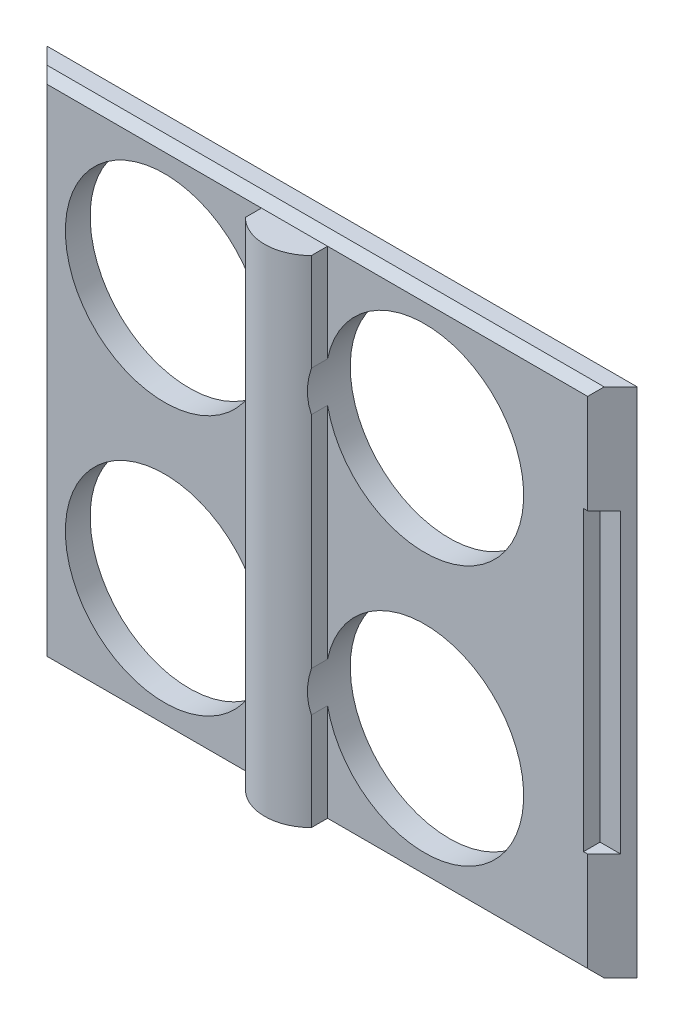
ISO-10303-21;
HEADER;
FILE_DESCRIPTION(('STEP AP214'),'2;1');
FILE_NAME('part.step','',(''),(''),'','','');
FILE_SCHEMA(('AUTOMOTIVE_DESIGN { 1 0 10303 214 1 1 1 1 }'));
ENDSEC;
DATA;
#1=APPLICATION_CONTEXT('core data for automotive mechanical design processes');
#2=APPLICATION_PROTOCOL_DEFINITION('international standard','automotive_design',2000,#1);
#3=PRODUCT_CONTEXT('',#1,'mechanical');
#4=PRODUCT('Part','Part','',(#3));
#5=PRODUCT_RELATED_PRODUCT_CATEGORY('part','',(#4));
#6=PRODUCT_DEFINITION_FORMATION('','',#4);
#7=PRODUCT_DEFINITION_CONTEXT('part definition',#1,'design');
#8=PRODUCT_DEFINITION('design','',#6,#7);
#9=PRODUCT_DEFINITION_SHAPE('','',#8);
#10=(LENGTH_UNIT() NAMED_UNIT(*) SI_UNIT(.MILLI.,.METRE.));
#11=(NAMED_UNIT(*) PLANE_ANGLE_UNIT() SI_UNIT($,.RADIAN.));
#12=(NAMED_UNIT(*) SI_UNIT($,.STERADIAN.) SOLID_ANGLE_UNIT());
#13=UNCERTAINTY_MEASURE_WITH_UNIT(LENGTH_MEASURE(1.E-05),#10,'distance_accuracy_value','');
#14=(GEOMETRIC_REPRESENTATION_CONTEXT(3) GLOBAL_UNCERTAINTY_ASSIGNED_CONTEXT((#13)) GLOBAL_UNIT_ASSIGNED_CONTEXT((#10,
#11,#12)) REPRESENTATION_CONTEXT('',''));
#15=CARTESIAN_POINT('',(0.,0.,0.));
#16=DIRECTION('',(0.,0.,1.));
#17=DIRECTION('',(1.,0.,0.));
#18=AXIS2_PLACEMENT_3D('',#15,#16,#17);
#19=CARTESIAN_POINT('',(0.,60.,3.));
#20=DIRECTION('',(0.,0.707106781186547,0.707106781186548));
#21=DIRECTION('',(0.,-0.707106781186548,0.707106781186547));
#22=AXIS2_PLACEMENT_3D('',#19,#20,#21);
#23=PLANE('',#22);
#24=DIRECTION('',(1.,0.,0.));
#25=VECTOR('',#24,1.);
#26=CARTESIAN_POINT('',(0.,61.,2.));
#27=LINE('',#26,#25);
#28=CARTESIAN_POINT('',(-1.,61.,2.));
#29=VERTEX_POINT('',#28);
#30=CARTESIAN_POINT('',(66.5,61.,2.00000000000001));
#31=VERTEX_POINT('',#30);
#32=EDGE_CURVE('E65',#29,#31,#27,.T.);
#33=ORIENTED_EDGE('',*,*,#32,.F.);
#34=DIRECTION('',(0.577350269189626,-0.577350269189626,0.577350269189626));
#35=VECTOR('',#34,1.);
#36=CARTESIAN_POINT('',(0.,60.,3.));
#37=LINE('',#36,#35);
#38=CARTESIAN_POINT('',(0.,60.,3.));
#39=VERTEX_POINT('',#38);
#40=EDGE_CURVE('E339',#29,#39,#37,.T.);
#41=ORIENTED_EDGE('',*,*,#40,.T.);
#42=DIRECTION('',(-1.,0.,0.));
#43=VECTOR('',#42,1.);
#44=CARTESIAN_POINT('',(0.,60.,3.));
#45=LINE('',#44,#43);
#46=CARTESIAN_POINT('',(26.,60.,3.));
#47=VERTEX_POINT('',#46);
#48=EDGE_CURVE('E244',#47,#39,#45,.T.);
#49=ORIENTED_EDGE('',*,*,#48,.F.);
#50=DIRECTION('',(1.,0.,0.));
#51=VECTOR('',#50,1.);
#52=CARTESIAN_POINT('',(0.,60.,3.));
#53=LINE('',#52,#51);
#54=CARTESIAN_POINT('',(34.,60.,3.));
#55=VERTEX_POINT('',#54);
#56=EDGE_CURVE('E252',#47,#55,#53,.T.);
#57=ORIENTED_EDGE('',*,*,#56,.T.);
#58=CARTESIAN_POINT('',(65.5000000000001,60.,3.));
#59=VERTEX_POINT('',#58);
#60=EDGE_CURVE('E245',#59,#55,#45,.T.);
#61=ORIENTED_EDGE('',*,*,#60,.F.);
#62=DIRECTION('',(0.577350269189619,0.57735026918963,-0.577350269189629));
#63=VECTOR('',#62,1.);
#64=CARTESIAN_POINT('',(43.6666666666672,38.1666666666668,24.8333333333332));
#65=LINE('',#64,#63);
#66=EDGE_CURVE('E380',#59,#31,#65,.T.);
#67=ORIENTED_EDGE('',*,*,#66,.T.);
#68=EDGE_LOOP('',(#33,#41,#49,#57,#61,#67));
#69=FACE_BOUND('',#68,.T.);
#70=ADVANCED_FACE('F43',(#69),#23,.T.);
#71=CARTESIAN_POINT('',(0.,-3.,0.));
#72=DIRECTION('',(0.,-0.707106781186548,0.707106781186547));
#73=DIRECTION('',(0.,-0.707106781186547,-0.707106781186548));
#74=AXIS2_PLACEMENT_3D('',#71,#72,#73);
#75=PLANE('',#74);
#76=DIRECTION('',(-1.,0.,0.));
#77=VECTOR('',#76,1.);
#78=CARTESIAN_POINT('',(0.,-1.00000000000001,1.99999999999999));
#79=LINE('',#78,#77);
#80=CARTESIAN_POINT('',(66.5,-0.999999999999994,2.00000000000002));
#81=VERTEX_POINT('',#80);
#82=CARTESIAN_POINT('',(-1.00000000000001,-1.00000000000001,1.99999999999999));
#83=VERTEX_POINT('',#82);
#84=EDGE_CURVE('E360',#81,#83,#79,.T.);
#85=ORIENTED_EDGE('',*,*,#84,.F.);
#86=DIRECTION('',(-0.577350269189619,0.577350269189629,0.577350269189629));
#87=VECTOR('',#86,1.);
#88=CARTESIAN_POINT('',(45.6666666666672,19.8333333333332,22.8333333333332));
#89=LINE('',#88,#87);
#90=CARTESIAN_POINT('',(65.5000000000001,0.,3.));
#91=VERTEX_POINT('',#90);
#92=EDGE_CURVE('E378',#81,#91,#89,.T.);
#93=ORIENTED_EDGE('',*,*,#92,.T.);
#94=DIRECTION('',(1.,0.,0.));
#95=VECTOR('',#94,1.);
#96=CARTESIAN_POINT('',(0.,0.,3.));
#97=LINE('',#96,#95);
#98=CARTESIAN_POINT('',(34.,0.,3.));
#99=VERTEX_POINT('',#98);
#100=EDGE_CURVE('E239',#99,#91,#97,.T.);
#101=ORIENTED_EDGE('',*,*,#100,.F.);
#102=DIRECTION('',(1.,0.,0.));
#103=VECTOR('',#102,1.);
#104=CARTESIAN_POINT('',(0.,0.,3.));
#105=LINE('',#104,#103);
#106=CARTESIAN_POINT('',(26.,0.,3.));
#107=VERTEX_POINT('',#106);
#108=EDGE_CURVE('E248',#107,#99,#105,.T.);
#109=ORIENTED_EDGE('',*,*,#108,.F.);
#110=CARTESIAN_POINT('',(0.,0.,3.));
#111=VERTEX_POINT('',#110);
#112=EDGE_CURVE('E242',#111,#107,#97,.T.);
#113=ORIENTED_EDGE('',*,*,#112,.F.);
#114=DIRECTION('',(-0.577350269189626,-0.577350269189626,-0.577350269189626));
#115=VECTOR('',#114,1.);
#116=CARTESIAN_POINT('',(-2.,-2.,1.));
#117=LINE('',#116,#115);
#118=EDGE_CURVE('E336',#111,#83,#117,.T.);
#119=ORIENTED_EDGE('',*,*,#118,.T.);
#120=EDGE_LOOP('',(#85,#93,#101,#109,#113,#119));
#121=FACE_BOUND('',#120,.T.);
#122=ADVANCED_FACE('F428',(#121),#75,.T.);
#123=CARTESIAN_POINT('',(0.,0.,3.));
#124=DIRECTION('',(0.,0.,-1.));
#125=DIRECTION('',(-1.,0.,0.));
#126=AXIS2_PLACEMENT_3D('',#123,#124,#125);
#127=PLANE('',#126);
#128=DIRECTION('',(0.,-1.,0.));
#129=VECTOR('',#128,1.);
#130=CARTESIAN_POINT('',(65.5000000000001,63.,3.));
#131=LINE('',#130,#129);
#132=CARTESIAN_POINT('',(65.5000000000001,48.,3.));
#133=VERTEX_POINT('',#132);
#134=EDGE_CURVE('E288',#59,#133,#131,.T.);
#135=ORIENTED_EDGE('',*,*,#134,.F.);
#136=ORIENTED_EDGE('',*,*,#60,.T.);
#137=DIRECTION('',(0.,1.,0.));
#138=VECTOR('',#137,1.);
#139=CARTESIAN_POINT('',(34.,60.,3.));
#140=LINE('',#139,#138);
#141=CARTESIAN_POINT('',(34.,48.1866985862022,3.));
#142=VERTEX_POINT('',#141);
#143=EDGE_CURVE('E247',#142,#55,#140,.T.);
#144=ORIENTED_EDGE('',*,*,#143,.F.);
#145=CARTESIAN_POINT('',(45.75,45.75,3.));
#146=DIRECTION('',(0.,0.,1.));
#147=DIRECTION('',(1.,0.,0.));
#148=AXIS2_PLACEMENT_3D('',#145,#146,#147);
#149=CIRCLE('',#148,12.);
#150=CARTESIAN_POINT('',(34.,43.3133014137978,3.));
#151=VERTEX_POINT('',#150);
#152=EDGE_CURVE('E230',#151,#142,#149,.T.);
#153=ORIENTED_EDGE('',*,*,#152,.F.);
#154=CARTESIAN_POINT('',(34.,16.6866985862023,3.));
#155=VERTEX_POINT('',#154);
#156=EDGE_CURVE('E269',#155,#151,#140,.T.);
#157=ORIENTED_EDGE('',*,*,#156,.F.);
#158=CARTESIAN_POINT('',(45.75,14.25,3.));
#159=DIRECTION('',(0.,0.,1.));
#160=DIRECTION('',(1.,0.,0.));
#161=AXIS2_PLACEMENT_3D('',#158,#159,#160);
#162=CIRCLE('',#161,12.);
#163=CARTESIAN_POINT('',(34.,11.8133014137977,3.));
#164=VERTEX_POINT('',#163);
#165=EDGE_CURVE('E224',#164,#155,#162,.T.);
#166=ORIENTED_EDGE('',*,*,#165,.F.);
#167=EDGE_CURVE('E264',#99,#164,#140,.T.);
#168=ORIENTED_EDGE('',*,*,#167,.F.);
#169=ORIENTED_EDGE('',*,*,#100,.T.);
#170=CARTESIAN_POINT('',(65.5000000000001,12.,3.));
#171=VERTEX_POINT('',#170);
#172=EDGE_CURVE('E368',#171,#91,#131,.T.);
#173=ORIENTED_EDGE('',*,*,#172,.F.);
#174=DIRECTION('',(1.,0.,0.));
#175=VECTOR('',#174,1.);
#176=CARTESIAN_POINT('',(65.,12.,3.));
#177=LINE('',#176,#175);
#178=CARTESIAN_POINT('',(65.,12.,3.));
#179=VERTEX_POINT('',#178);
#180=EDGE_CURVE('E396',#179,#171,#177,.T.);
#181=ORIENTED_EDGE('',*,*,#180,.F.);
#182=DIRECTION('',(0.,-1.,0.));
#183=VECTOR('',#182,1.);
#184=CARTESIAN_POINT('',(65.,48.,3.));
#185=LINE('',#184,#183);
#186=CARTESIAN_POINT('',(65.,48.,3.));
#187=VERTEX_POINT('',#186);
#188=EDGE_CURVE('E383',#187,#179,#185,.T.);
#189=ORIENTED_EDGE('',*,*,#188,.F.);
#190=DIRECTION('',(-1.,0.,0.));
#191=VECTOR('',#190,1.);
#192=CARTESIAN_POINT('',(65.,48.,3.));
#193=LINE('',#192,#191);
#194=EDGE_CURVE('E388',#133,#187,#193,.T.);
#195=ORIENTED_EDGE('',*,*,#194,.F.);
#196=EDGE_LOOP('',(#135,#136,#144,#153,#157,#166,#168,#169,#173,#181,#189,#195));
#197=FACE_BOUND('',#196,.T.);
#198=ADVANCED_FACE('F285',(#197),#127,.F.);
#199=CARTESIAN_POINT('',(65.,48.,1.));
#200=DIRECTION('',(0.,1.,0.));
#201=DIRECTION('',(0.,0.,1.));
#202=AXIS2_PLACEMENT_3D('',#199,#200,#201);
#203=PLANE('',#202);
#204=DIRECTION('',(0.707106781186541,0.,-0.707106781186554));
#205=VECTOR('',#204,1.);
#206=CARTESIAN_POINT('',(66.25,48.,2.25000000000001));
#207=LINE('',#206,#205);
#208=CARTESIAN_POINT('',(67.5,48.,1.));
#209=VERTEX_POINT('',#208);
#210=EDGE_CURVE('E376',#133,#209,#207,.T.);
#211=ORIENTED_EDGE('',*,*,#210,.F.);
#212=ORIENTED_EDGE('',*,*,#194,.T.);
#213=DIRECTION('',(0.,0.,1.));
#214=VECTOR('',#213,1.);
#215=CARTESIAN_POINT('',(65.,48.,1.));
#216=LINE('',#215,#214);
#217=CARTESIAN_POINT('',(65.,48.,1.));
#218=VERTEX_POINT('',#217);
#219=EDGE_CURVE('E400',#218,#187,#216,.T.);
#220=ORIENTED_EDGE('',*,*,#219,.F.);
#221=DIRECTION('',(-1.,0.,0.));
#222=VECTOR('',#221,1.);
#223=CARTESIAN_POINT('',(65.,48.,1.));
#224=LINE('',#223,#222);
#225=EDGE_CURVE('E391',#209,#218,#224,.T.);
#226=ORIENTED_EDGE('',*,*,#225,.F.);
#227=EDGE_LOOP('',(#211,#212,#220,#226));
#228=FACE_BOUND('',#227,.T.);
#229=ADVANCED_FACE('F447',(#228),#203,.F.);
#230=CARTESIAN_POINT('',(65.,12.,1.));
#231=DIRECTION('',(0.,-1.,0.));
#232=DIRECTION('',(0.,0.,-1.));
#233=AXIS2_PLACEMENT_3D('',#230,#231,#232);
#234=PLANE('',#233);
#235=DIRECTION('',(-0.707106781186541,0.,0.707106781186554));
#236=VECTOR('',#235,1.);
#237=CARTESIAN_POINT('',(66.25,12.,2.25000000000002));
#238=LINE('',#237,#236);
#239=CARTESIAN_POINT('',(67.5,12.,1.));
#240=VERTEX_POINT('',#239);
#241=EDGE_CURVE('E374',#240,#171,#238,.T.);
#242=ORIENTED_EDGE('',*,*,#241,.F.);
#243=DIRECTION('',(1.,0.,0.));
#244=VECTOR('',#243,1.);
#245=CARTESIAN_POINT('',(65.,12.,1.));
#246=LINE('',#245,#244);
#247=CARTESIAN_POINT('',(65.,12.,1.));
#248=VERTEX_POINT('',#247);
#249=EDGE_CURVE('E387',#248,#240,#246,.T.);
#250=ORIENTED_EDGE('',*,*,#249,.F.);
#251=DIRECTION('',(0.,0.,1.));
#252=VECTOR('',#251,1.);
#253=CARTESIAN_POINT('',(65.,12.,1.));
#254=LINE('',#253,#252);
#255=EDGE_CURVE('E393',#248,#179,#254,.T.);
#256=ORIENTED_EDGE('',*,*,#255,.T.);
#257=ORIENTED_EDGE('',*,*,#180,.T.);
#258=EDGE_LOOP('',(#242,#250,#256,#257));
#259=FACE_BOUND('',#258,.T.);
#260=ADVANCED_FACE('F436',(#259),#234,.F.);
#261=CARTESIAN_POINT('',(0.,0.,1.));
#262=DIRECTION('',(0.,0.,1.));
#263=DIRECTION('',(1.,0.,0.));
#264=AXIS2_PLACEMENT_3D('',#261,#262,#263);
#265=PLANE('',#264);
#266=ORIENTED_EDGE('',*,*,#249,.T.);
#267=DIRECTION('',(0.,1.,0.));
#268=VECTOR('',#267,1.);
#269=CARTESIAN_POINT('',(67.5,0.,1.));
#270=LINE('',#269,#268);
#271=EDGE_CURVE('E371',#240,#209,#270,.T.);
#272=ORIENTED_EDGE('',*,*,#271,.T.);
#273=ORIENTED_EDGE('',*,*,#225,.T.);
#274=DIRECTION('',(0.,-1.,0.));
#275=VECTOR('',#274,1.);
#276=CARTESIAN_POINT('',(65.,48.,1.));
#277=LINE('',#276,#275);
#278=EDGE_CURVE('E384',#218,#248,#277,.T.);
#279=ORIENTED_EDGE('',*,*,#278,.T.);
#280=EDGE_LOOP('',(#266,#272,#273,#279));
#281=FACE_BOUND('',#280,.T.);
#282=ADVANCED_FACE('F438',(#281),#265,.T.);
#283=CARTESIAN_POINT('',(26.,60.,7.));
#284=DIRECTION('',(1.,0.,0.));
#285=DIRECTION('',(0.,1.,0.));
#286=AXIS2_PLACEMENT_3D('',#283,#284,#285);
#287=PLANE('',#286);
#288=DIRECTION('',(0.,0.,-1.));
#289=VECTOR('',#288,1.);
#290=CARTESIAN_POINT('',(26.,0.,7.));
#291=LINE('',#290,#289);
#292=CARTESIAN_POINT('',(26.,0.,4.95399722804954));
#293=VERTEX_POINT('',#292);
#294=EDGE_CURVE('E203',#293,#107,#291,.T.);
#295=ORIENTED_EDGE('',*,*,#294,.F.);
#296=DIRECTION('',(0.,-1.,0.));
#297=VECTOR('',#296,1.);
#298=CARTESIAN_POINT('',(26.,61.,4.95399722804954));
#299=LINE('',#298,#297);
#300=CARTESIAN_POINT('',(26.,11.8133014137978,4.95399722804954));
#301=VERTEX_POINT('',#300);
#302=EDGE_CURVE('E189',#301,#293,#299,.T.);
#303=ORIENTED_EDGE('',*,*,#302,.F.);
#304=DIRECTION('',(0.,0.,-1.));
#305=VECTOR('',#304,1.);
#306=CARTESIAN_POINT('',(26.,11.8133014137978,10.));
#307=LINE('',#306,#305);
#308=CARTESIAN_POINT('',(26.,11.8133014137978,3.));
#309=VERTEX_POINT('',#308);
#310=EDGE_CURVE('E405',#301,#309,#307,.T.);
#311=ORIENTED_EDGE('',*,*,#310,.T.);
#312=DIRECTION('',(0.,-1.,0.));
#313=VECTOR('',#312,1.);
#314=CARTESIAN_POINT('',(26.,60.,3.));
#315=LINE('',#314,#313);
#316=EDGE_CURVE('E211',#309,#107,#315,.T.);
#317=ORIENTED_EDGE('',*,*,#316,.T.);
#318=EDGE_LOOP('',(#295,#303,#311,#317));
#319=FACE_BOUND('',#318,.T.);
#320=ADVANCED_FACE('F209',(#319),#287,.F.);
#321=DIRECTION('',(0.,0.,-1.));
#322=VECTOR('',#321,1.);
#323=CARTESIAN_POINT('',(26.,16.6866985862022,10.));
#324=LINE('',#323,#322);
#325=CARTESIAN_POINT('',(26.,16.6866985862022,3.));
#326=VERTEX_POINT('',#325);
#327=CARTESIAN_POINT('',(26.,16.6866985862022,4.95399722804954));
#328=VERTEX_POINT('',#327);
#329=EDGE_CURVE('E306',#326,#328,#324,.F.);
#330=ORIENTED_EDGE('',*,*,#329,.T.);
#331=CARTESIAN_POINT('',(26.,43.3133014137978,4.95399722804954));
#332=VERTEX_POINT('',#331);
#333=EDGE_CURVE('E196',#332,#328,#299,.T.);
#334=ORIENTED_EDGE('',*,*,#333,.F.);
#335=DIRECTION('',(0.,0.,-1.));
#336=VECTOR('',#335,1.);
#337=CARTESIAN_POINT('',(26.,43.3133014137978,10.));
#338=LINE('',#337,#336);
#339=CARTESIAN_POINT('',(26.,43.3133014137978,3.));
#340=VERTEX_POINT('',#339);
#341=EDGE_CURVE('E308',#332,#340,#338,.T.);
#342=ORIENTED_EDGE('',*,*,#341,.T.);
#343=EDGE_CURVE('E257',#340,#326,#315,.T.);
#344=ORIENTED_EDGE('',*,*,#343,.T.);
#345=EDGE_LOOP('',(#330,#334,#342,#344));
#346=FACE_BOUND('',#345,.T.);
#347=ADVANCED_FACE('F304',(#346),#287,.F.);
#348=CARTESIAN_POINT('',(34.,60.,7.));
#349=DIRECTION('',(-1.,0.,0.));
#350=DIRECTION('',(0.,-1.,0.));
#351=AXIS2_PLACEMENT_3D('',#348,#349,#350);
#352=PLANE('',#351);
#353=DIRECTION('',(0.,0.,-1.));
#354=VECTOR('',#353,1.);
#355=CARTESIAN_POINT('',(34.,43.3133014137978,10.));
#356=LINE('',#355,#354);
#357=CARTESIAN_POINT('',(34.,43.3133014137977,4.95399722804951));
#358=VERTEX_POINT('',#357);
#359=EDGE_CURVE('E326',#151,#358,#356,.F.);
#360=ORIENTED_EDGE('',*,*,#359,.T.);
#361=DIRECTION('',(0.,-1.,0.));
#362=VECTOR('',#361,1.);
#363=CARTESIAN_POINT('',(34.,61.,4.95399722804951));
#364=LINE('',#363,#362);
#365=CARTESIAN_POINT('',(34.,16.6866985862023,4.95399722804951));
#366=VERTEX_POINT('',#365);
#367=EDGE_CURVE('E408',#358,#366,#364,.T.);
#368=ORIENTED_EDGE('',*,*,#367,.T.);
#369=DIRECTION('',(0.,0.,-1.));
#370=VECTOR('',#369,1.);
#371=CARTESIAN_POINT('',(34.,16.6866985862023,10.));
#372=LINE('',#371,#370);
#373=EDGE_CURVE('E332',#366,#155,#372,.T.);
#374=ORIENTED_EDGE('',*,*,#373,.T.);
#375=ORIENTED_EDGE('',*,*,#156,.T.);
#376=EDGE_LOOP('',(#360,#368,#374,#375));
#377=FACE_BOUND('',#376,.T.);
#378=ADVANCED_FACE('F407',(#377),#352,.F.);
#379=DIRECTION('',(0.,0.,-1.));
#380=VECTOR('',#379,1.);
#381=CARTESIAN_POINT('',(34.,60.,7.));
#382=LINE('',#381,#380);
#383=CARTESIAN_POINT('',(34.,60.,4.95399722804951));
#384=VERTEX_POINT('',#383);
#385=EDGE_CURVE('E217',#384,#55,#382,.T.);
#386=ORIENTED_EDGE('',*,*,#385,.F.);
#387=CARTESIAN_POINT('',(34.,48.1866985862023,4.95399722804951));
#388=VERTEX_POINT('',#387);
#389=EDGE_CURVE('E197',#384,#388,#364,.T.);
#390=ORIENTED_EDGE('',*,*,#389,.T.);
#391=DIRECTION('',(0.,0.,-1.));
#392=VECTOR('',#391,1.);
#393=CARTESIAN_POINT('',(34.,48.1866985862022,10.));
#394=LINE('',#393,#392);
#395=EDGE_CURVE('E295',#388,#142,#394,.T.);
#396=ORIENTED_EDGE('',*,*,#395,.T.);
#397=ORIENTED_EDGE('',*,*,#143,.T.);
#398=EDGE_LOOP('',(#386,#390,#396,#397));
#399=FACE_BOUND('',#398,.T.);
#400=ADVANCED_FACE('F293',(#399),#352,.F.);
#401=DIRECTION('',(0.,-1.,0.));
#402=VECTOR('',#401,1.);
#403=CARTESIAN_POINT('',(0.,63.,3.));
#404=LINE('',#403,#402);
#405=EDGE_CURVE('E334',#39,#111,#404,.T.);
#406=ORIENTED_EDGE('',*,*,#405,.T.);
#407=ORIENTED_EDGE('',*,*,#112,.T.);
#408=ORIENTED_EDGE('',*,*,#316,.F.);
#409=CARTESIAN_POINT('',(14.25,14.25,3.));
#410=DIRECTION('',(0.,0.,1.));
#411=DIRECTION('',(1.,0.,0.));
#412=AXIS2_PLACEMENT_3D('',#409,#410,#411);
#413=CIRCLE('',#412,12.);
#414=EDGE_CURVE('E215',#326,#309,#413,.T.);
#415=ORIENTED_EDGE('',*,*,#414,.F.);
#416=ORIENTED_EDGE('',*,*,#343,.F.);
#417=CARTESIAN_POINT('',(14.25,45.75,3.));
#418=DIRECTION('',(0.,0.,1.));
#419=DIRECTION('',(1.,0.,0.));
#420=AXIS2_PLACEMENT_3D('',#417,#418,#419);
#421=CIRCLE('',#420,12.);
#422=CARTESIAN_POINT('',(26.,48.1866985862022,3.));
#423=VERTEX_POINT('',#422);
#424=EDGE_CURVE('E236',#423,#340,#421,.T.);
#425=ORIENTED_EDGE('',*,*,#424,.F.);
#426=EDGE_CURVE('E261',#47,#423,#315,.T.);
#427=ORIENTED_EDGE('',*,*,#426,.F.);
#428=ORIENTED_EDGE('',*,*,#48,.T.);
#429=EDGE_LOOP('',(#406,#407,#408,#415,#416,#425,#427,#428));
#430=FACE_BOUND('',#429,.T.);
#431=ADVANCED_FACE('F313',(#430),#127,.F.);
#432=CARTESIAN_POINT('',(0.,60.,3.));
#433=DIRECTION('',(0.,-1.,0.));
#434=DIRECTION('',(0.,0.,-1.));
#435=AXIS2_PLACEMENT_3D('',#432,#433,#434);
#436=PLANE('',#435);
#437=DIRECTION('',(0.,0.,-1.));
#438=VECTOR('',#437,1.);
#439=CARTESIAN_POINT('',(26.,60.,7.));
#440=LINE('',#439,#438);
#441=CARTESIAN_POINT('',(26.,60.,4.95399722804954));
#442=VERTEX_POINT('',#441);
#443=EDGE_CURVE('E268',#442,#47,#440,.T.);
#444=ORIENTED_EDGE('',*,*,#443,.F.);
#445=CARTESIAN_POINT('',(30.,60.,0.953997228049515));
#446=DIRECTION('',(0.,-1.,0.));
#447=DIRECTION('',(0.,0.,-1.));
#448=AXIS2_PLACEMENT_3D('',#445,#446,#447);
#449=CIRCLE('',#448,5.65685424949239);
#450=EDGE_CURVE('E277',#442,#384,#449,.F.);
#451=ORIENTED_EDGE('',*,*,#450,.T.);
#452=ORIENTED_EDGE('',*,*,#385,.T.);
#453=ORIENTED_EDGE('',*,*,#56,.F.);
#454=EDGE_LOOP('',(#444,#451,#452,#453));
#455=FACE_BOUND('',#454,.T.);
#456=ADVANCED_FACE('F275',(#455),#436,.F.);
#457=CARTESIAN_POINT('',(0.,0.,0.));
#458=DIRECTION('',(0.,0.,-1.));
#459=DIRECTION('',(-1.,0.,0.));
#460=AXIS2_PLACEMENT_3D('',#457,#458,#459);
#461=PLANE('',#460);
#462=DIRECTION('',(1.,0.,0.));
#463=VECTOR('',#462,1.);
#464=CARTESIAN_POINT('',(-3.,61.,0.));
#465=LINE('',#464,#463);
#466=CARTESIAN_POINT('',(-3.,61.,0.));
#467=VERTEX_POINT('',#466);
#468=CARTESIAN_POINT('',(68.5,61.,0.));
#469=VERTEX_POINT('',#468);
#470=EDGE_CURVE('E355',#467,#469,#465,.T.);
#471=ORIENTED_EDGE('',*,*,#470,.T.);
#472=DIRECTION('',(0.,1.,0.));
#473=VECTOR('',#472,1.);
#474=CARTESIAN_POINT('',(68.5,-3.,0.));
#475=LINE('',#474,#473);
#476=CARTESIAN_POINT('',(68.5,-1.,0.));
#477=VERTEX_POINT('',#476);
#478=EDGE_CURVE('E358',#477,#469,#475,.T.);
#479=ORIENTED_EDGE('',*,*,#478,.F.);
#480=DIRECTION('',(-1.,0.,0.));
#481=VECTOR('',#480,1.);
#482=CARTESIAN_POINT('',(68.5,-1.,0.));
#483=LINE('',#482,#481);
#484=CARTESIAN_POINT('',(-3.,-1.00000000000001,0.));
#485=VERTEX_POINT('',#484);
#486=EDGE_CURVE('E357',#477,#485,#483,.T.);
#487=ORIENTED_EDGE('',*,*,#486,.T.);
#488=DIRECTION('',(0.,-1.,0.));
#489=VECTOR('',#488,1.);
#490=CARTESIAN_POINT('',(-3.,-3.,0.));
#491=LINE('',#490,#489);
#492=EDGE_CURVE('E265',#467,#485,#491,.T.);
#493=ORIENTED_EDGE('',*,*,#492,.F.);
#494=EDGE_LOOP('',(#471,#479,#487,#493));
#495=FACE_BOUND('',#494,.T.);
#496=CARTESIAN_POINT('',(45.75,14.25,0.));
#497=DIRECTION('',(0.,0.,1.));
#498=DIRECTION('',(1.,0.,0.));
#499=AXIS2_PLACEMENT_3D('',#496,#497,#498);
#500=CIRCLE('',#499,12.);
#501=CARTESIAN_POINT('',(57.75,14.25,0.));
#502=VERTEX_POINT('',#501);
#503=EDGE_CURVE('E222',#502,#502,#500,.T.);
#504=ORIENTED_EDGE('',*,*,#503,.T.);
#505=EDGE_LOOP('',(#504));
#506=FACE_BOUND('',#505,.T.);
#507=CARTESIAN_POINT('',(14.25,45.75,0.));
#508=DIRECTION('',(0.,0.,1.));
#509=DIRECTION('',(1.,0.,0.));
#510=AXIS2_PLACEMENT_3D('',#507,#508,#509);
#511=CIRCLE('',#510,12.);
#512=CARTESIAN_POINT('',(26.25,45.75,0.));
#513=VERTEX_POINT('',#512);
#514=EDGE_CURVE('E233',#513,#513,#511,.T.);
#515=ORIENTED_EDGE('',*,*,#514,.T.);
#516=EDGE_LOOP('',(#515));
#517=FACE_BOUND('',#516,.T.);
#518=CARTESIAN_POINT('',(45.75,45.75,0.));
#519=DIRECTION('',(0.,0.,1.));
#520=DIRECTION('',(1.,0.,0.));
#521=AXIS2_PLACEMENT_3D('',#518,#519,#520);
#522=CIRCLE('',#521,12.);
#523=CARTESIAN_POINT('',(57.75,45.75,0.));
#524=VERTEX_POINT('',#523);
#525=EDGE_CURVE('E227',#524,#524,#522,.T.);
#526=ORIENTED_EDGE('',*,*,#525,.T.);
#527=EDGE_LOOP('',(#526));
#528=FACE_BOUND('',#527,.T.);
#529=CARTESIAN_POINT('',(14.25,14.25,0.));
#530=DIRECTION('',(0.,0.,1.));
#531=DIRECTION('',(1.,0.,0.));
#532=AXIS2_PLACEMENT_3D('',#529,#530,#531);
#533=CIRCLE('',#532,12.);
#534=CARTESIAN_POINT('',(26.25,14.25,0.));
#535=VERTEX_POINT('',#534);
#536=EDGE_CURVE('E212',#535,#535,#533,.T.);
#537=ORIENTED_EDGE('',*,*,#536,.T.);
#538=EDGE_LOOP('',(#537));
#539=FACE_BOUND('',#538,.T.);
#540=ADVANCED_FACE('F352',(#495,#506,#517,#528,#539),#461,.T.);
#541=CARTESIAN_POINT('',(0.,0.,3.));
#542=DIRECTION('',(0.,1.,0.));
#543=DIRECTION('',(0.,0.,1.));
#544=AXIS2_PLACEMENT_3D('',#541,#542,#543);
#545=PLANE('',#544);
#546=DIRECTION('',(0.,0.,-1.));
#547=VECTOR('',#546,1.);
#548=CARTESIAN_POINT('',(34.,0.,7.));
#549=LINE('',#548,#547);
#550=CARTESIAN_POINT('',(34.,0.,4.95399722804951));
#551=VERTEX_POINT('',#550);
#552=EDGE_CURVE('E205',#551,#99,#549,.T.);
#553=ORIENTED_EDGE('',*,*,#552,.F.);
#554=CARTESIAN_POINT('',(30.,0.,0.953997228049515));
#555=DIRECTION('',(0.,1.,0.));
#556=DIRECTION('',(0.,0.,1.));
#557=AXIS2_PLACEMENT_3D('',#554,#555,#556);
#558=CIRCLE('',#557,5.65685424949239);
#559=EDGE_CURVE('E58',#293,#551,#558,.T.);
#560=ORIENTED_EDGE('',*,*,#559,.F.);
#561=ORIENTED_EDGE('',*,*,#294,.T.);
#562=ORIENTED_EDGE('',*,*,#108,.T.);
#563=EDGE_LOOP('',(#553,#560,#561,#562));
#564=FACE_BOUND('',#563,.T.);
#565=ADVANCED_FACE('F45',(#564),#545,.F.);
#566=CARTESIAN_POINT('',(14.25,45.75,3.));
#567=DIRECTION('',(0.,0.,-1.));
#568=DIRECTION('',(-1.,0.,0.));
#569=AXIS2_PLACEMENT_3D('',#566,#567,#568);
#570=CYLINDRICAL_SURFACE('',#569,12.);
#571=CARTESIAN_POINT('',(26.,48.1866985862022,4.95399722804954));
#572=CARTESIAN_POINT('',(26.0241801299489,48.0701189857497,4.97816530256985));
#573=CARTESIAN_POINT('',(26.0467013192325,47.9527745613815,5.0002600290914));
#574=CARTESIAN_POINT('',(26.0883242069555,47.7168259450355,5.04051848423972));
#575=CARTESIAN_POINT('',(26.1074263250843,47.5982219095702,5.05868269539267));
#576=CARTESIAN_POINT('',(26.1421114086018,47.3600229392542,5.09129784788001));
#577=CARTESIAN_POINT('',(26.1576951929136,47.2404282417213,5.10574965341758));
#578=CARTESIAN_POINT('',(26.1852818410666,47.0004559509331,5.13111022948324));
#579=CARTESIAN_POINT('',(26.1972845640345,46.8800783270691,5.14201886063002));
#580=CARTESIAN_POINT('',(26.2273833863458,46.5234971254894,5.16922209920685));
#581=CARTESIAN_POINT('',(26.2403530370253,46.2864592992032,5.18071243468796));
#582=CARTESIAN_POINT('',(26.252189438712,45.8117927784935,5.19121027958521));
#583=CARTESIAN_POINT('',(26.2510573448639,45.5741641340612,5.19021881144844));
#584=CARTESIAN_POINT('',(26.237044956094,45.1672285866786,5.17776481642798));
#585=CARTESIAN_POINT('',(26.2275950215316,44.9976982708761,5.16935831869834));
#586=CARTESIAN_POINT('',(26.2015637099564,44.6596508117252,5.14591646384076));
#587=CARTESIAN_POINT('',(26.1849828899096,44.4911335902901,5.13088162442478));
#588=CARTESIAN_POINT('',(26.1444932902498,44.1529827409672,5.0935462866973));
#589=CARTESIAN_POINT('',(26.1204702177371,43.9833752091102,5.07113209890642));
#590=CARTESIAN_POINT('',(26.0654248176498,43.6464340360368,5.01853477308152));
#591=CARTESIAN_POINT('',(26.0343990734809,43.4791015472058,4.98834784172041));
#592=CARTESIAN_POINT('',(26.,43.3133014137978,4.95399722805007));
#593=B_SPLINE_CURVE_WITH_KNOTS('',3,(#571,#572,#573,#574,#575,#576,#577,#578,#579,#580,#581,
#582,#583,#584,#585,#586,#587,#588,#589,#590,#591,#592),.UNSPECIFIED.,.F.,.F.,(4,2,2,2,2,2,2,2,
2,2,4),(0.,0.364422485562474,0.72880020771324,1.09309303010683,1.45740018130651,
2.16959554692401,2.88173257342891,3.39147549847518,3.90117861669036,4.41913377841258,
4.93734219815442),.UNSPECIFIED.);
#594=CARTESIAN_POINT('',(26.,48.1866985862023,4.95399722804954));
#595=VERTEX_POINT('',#594);
#596=EDGE_CURVE('E320',#595,#332,#593,.T.);
#597=ORIENTED_EDGE('',*,*,#596,.F.);
#598=DIRECTION('',(0.,0.,-1.));
#599=VECTOR('',#598,1.);
#600=CARTESIAN_POINT('',(26.,48.1866985862022,10.));
#601=LINE('',#600,#599);
#602=EDGE_CURVE('E319',#423,#595,#601,.F.);
#603=ORIENTED_EDGE('',*,*,#602,.F.);
#604=ORIENTED_EDGE('',*,*,#424,.T.);
#605=ORIENTED_EDGE('',*,*,#341,.F.);
#606=EDGE_LOOP('',(#597,#603,#604,#605));
#607=FACE_BOUND('',#606,.T.);
#608=ORIENTED_EDGE('',*,*,#514,.F.);
#609=EDGE_LOOP('',(#608));
#610=FACE_BOUND('',#609,.T.);
#611=ADVANCED_FACE('F316',(#607,#610),#570,.F.);
#612=CARTESIAN_POINT('',(45.75,45.75,3.));
#613=DIRECTION('',(0.,0.,-1.));
#614=DIRECTION('',(-1.,0.,0.));
#615=AXIS2_PLACEMENT_3D('',#612,#613,#614);
#616=CYLINDRICAL_SURFACE('',#615,12.);
#617=CARTESIAN_POINT('',(34.,43.3133014137977,4.95399722804951));
#618=CARTESIAN_POINT('',(33.9758198700511,43.4298810142503,4.97816530256983));
#619=CARTESIAN_POINT('',(33.9532986807676,43.5472254386184,5.00026002909138));
#620=CARTESIAN_POINT('',(33.9116757930445,43.7831740549644,5.0405184842397));
#621=CARTESIAN_POINT('',(33.8925736749157,43.9017780904297,5.05868269539265));
#622=CARTESIAN_POINT('',(33.8578885913982,44.1399770607457,5.09129784787999));
#623=CARTESIAN_POINT('',(33.8423048070864,44.2595717582787,5.10574965341757));
#624=CARTESIAN_POINT('',(33.8147181589334,44.4995440490668,5.13111022948322));
#625=CARTESIAN_POINT('',(33.8027154359655,44.6199216729308,5.14201886063001));
#626=CARTESIAN_POINT('',(33.7726166136543,44.9765028745105,5.16922209920684));
#627=CARTESIAN_POINT('',(33.7596469629747,45.2135407007967,5.18071243468795));
#628=CARTESIAN_POINT('',(33.747810561288,45.6882072215064,5.1912102795852));
#629=CARTESIAN_POINT('',(33.7489426551361,45.9258358659387,5.19021881144844));
#630=CARTESIAN_POINT('',(33.762955043906,46.3327714133213,5.17776481642797));
#631=CARTESIAN_POINT('',(33.7724049784684,46.5023017291239,5.16935831869834));
#632=CARTESIAN_POINT('',(33.7984362900436,46.8403491882748,5.14591646384075));
#633=CARTESIAN_POINT('',(33.8150171100904,47.0088664097099,5.13088162442478));
#634=CARTESIAN_POINT('',(33.8555067097502,47.3470172590328,5.09354628669729));
#635=CARTESIAN_POINT('',(33.8795297822629,47.5166247908899,5.07113209890641));
#636=CARTESIAN_POINT('',(33.9345751823502,47.8535659639632,5.01853477308151));
#637=CARTESIAN_POINT('',(33.9656009265191,48.0208984527942,4.98834784172039));
#638=CARTESIAN_POINT('',(34.,48.1866985862023,4.95399722805004));
#639=B_SPLINE_CURVE_WITH_KNOTS('',3,(#617,#618,#619,#620,#621,#622,#623,#624,#625,#626,#627,
#628,#629,#630,#631,#632,#633,#634,#635,#636,#637,#638),.UNSPECIFIED.,.F.,.F.,(4,2,2,2,2,2,2,2,
2,2,4),(0.,0.364422485562476,0.728800207713234,1.09309303010682,1.45740018130651,2.169595546924,
2.88173257342891,3.39147549847523,3.90117861669044,4.41913377841271,4.93734219815458),.UNSPECIFIED.);
#640=EDGE_CURVE('E414',#358,#388,#639,.T.);
#641=ORIENTED_EDGE('',*,*,#640,.F.);
#642=ORIENTED_EDGE('',*,*,#359,.F.);
#643=ORIENTED_EDGE('',*,*,#152,.T.);
#644=ORIENTED_EDGE('',*,*,#395,.F.);
#645=EDGE_LOOP('',(#641,#642,#643,#644));
#646=FACE_BOUND('',#645,.T.);
#647=ORIENTED_EDGE('',*,*,#525,.F.);
#648=EDGE_LOOP('',(#647));
#649=FACE_BOUND('',#648,.T.);
#650=ADVANCED_FACE('F412',(#646,#649),#616,.F.);
#651=CARTESIAN_POINT('',(45.75,14.25,3.));
#652=DIRECTION('',(0.,0.,-1.));
#653=DIRECTION('',(-1.,0.,0.));
#654=AXIS2_PLACEMENT_3D('',#651,#652,#653);
#655=CYLINDRICAL_SURFACE('',#654,12.);
#656=CARTESIAN_POINT('',(34.,11.8133014137977,4.95399722804951));
#657=CARTESIAN_POINT('',(33.9758198700511,11.9298810142503,4.97816530256983));
#658=CARTESIAN_POINT('',(33.9532986807676,12.0472254386184,5.00026002909138));
#659=CARTESIAN_POINT('',(33.9116757930445,12.2831740549644,5.0405184842397));
#660=CARTESIAN_POINT('',(33.8925736749157,12.4017780904297,5.05868269539265));
#661=CARTESIAN_POINT('',(33.8578885913982,12.6399770607457,5.09129784787999));
#662=CARTESIAN_POINT('',(33.8423048070864,12.7595717582787,5.10574965341757));
#663=CARTESIAN_POINT('',(33.8147181589334,12.9995440490668,5.13111022948322));
#664=CARTESIAN_POINT('',(33.8027154359655,13.1199216729308,5.14201886063001));
#665=CARTESIAN_POINT('',(33.7726166136543,13.4765028745106,5.16922209920684));
#666=CARTESIAN_POINT('',(33.7596469629747,13.7135407007967,5.18071243468796));
#667=CARTESIAN_POINT('',(33.747810561288,14.1882072215064,5.1912102795852));
#668=CARTESIAN_POINT('',(33.7489426551361,14.4258358659388,5.19021881144844));
#669=CARTESIAN_POINT('',(33.762955043906,14.8327714133213,5.17776481642797));
#670=CARTESIAN_POINT('',(33.7724049784684,15.0023017291239,5.16935831869834));
#671=CARTESIAN_POINT('',(33.7984362900436,15.3403491882748,5.14591646384075));
#672=CARTESIAN_POINT('',(33.8150171100904,15.5088664097099,5.13088162442478));
#673=CARTESIAN_POINT('',(33.8555067097502,15.8470172590328,5.0935462866973));
#674=CARTESIAN_POINT('',(33.8795297822629,16.0166247908899,5.07113209890641));
#675=CARTESIAN_POINT('',(33.9345751823502,16.3535659639632,5.01853477308151));
#676=CARTESIAN_POINT('',(33.9656009265191,16.5208984527942,4.98834784172038));
#677=CARTESIAN_POINT('',(34.,16.6866985862023,4.95399722805004));
#678=B_SPLINE_CURVE_WITH_KNOTS('',3,(#656,#657,#658,#659,#660,#661,#662,#663,#664,#665,#666,
#667,#668,#669,#670,#671,#672,#673,#674,#675,#676,#677),.UNSPECIFIED.,.F.,.F.,(4,2,2,2,2,2,2,2,
2,2,4),(0.,0.364422485562478,0.728800207713244,1.09309303010683,1.45740018130652,
2.16959554692401,2.88173257342892,3.39147549847523,3.90117861669044,4.4191337784127,
4.93734219815458),.UNSPECIFIED.);
#679=CARTESIAN_POINT('',(34.,11.8133014137977,4.95399722804951));
#680=VERTEX_POINT('',#679);
#681=EDGE_CURVE('E420',#680,#366,#678,.T.);
#682=ORIENTED_EDGE('',*,*,#681,.F.);
#683=DIRECTION('',(0.,0.,-1.));
#684=VECTOR('',#683,1.);
#685=CARTESIAN_POINT('',(34.,11.8133014137977,10.));
#686=LINE('',#685,#684);
#687=EDGE_CURVE('E324',#164,#680,#686,.F.);
#688=ORIENTED_EDGE('',*,*,#687,.F.);
#689=ORIENTED_EDGE('',*,*,#165,.T.);
#690=ORIENTED_EDGE('',*,*,#373,.F.);
#691=EDGE_LOOP('',(#682,#688,#689,#690));
#692=FACE_BOUND('',#691,.T.);
#693=ORIENTED_EDGE('',*,*,#503,.F.);
#694=EDGE_LOOP('',(#693));
#695=FACE_BOUND('',#694,.T.);
#696=ADVANCED_FACE('F418',(#692,#695),#655,.F.);
#697=CARTESIAN_POINT('',(14.25,14.25,3.));
#698=DIRECTION('',(0.,0.,-1.));
#699=DIRECTION('',(-1.,0.,0.));
#700=AXIS2_PLACEMENT_3D('',#697,#698,#699);
#701=CYLINDRICAL_SURFACE('',#700,12.);
#702=CARTESIAN_POINT('',(26.,16.6866985862022,4.95399722804954));
#703=CARTESIAN_POINT('',(26.0241801299489,16.5701189857496,4.97816530256985));
#704=CARTESIAN_POINT('',(26.0467013192325,16.4527745613815,5.0002600290914));
#705=CARTESIAN_POINT('',(26.0883242069555,16.2168259450355,5.04051848423972));
#706=CARTESIAN_POINT('',(26.1074263250843,16.0982219095702,5.05868269539267));
#707=CARTESIAN_POINT('',(26.1421114086018,15.8600229392542,5.09129784788001));
#708=CARTESIAN_POINT('',(26.1576951929136,15.7404282417212,5.10574965341758));
#709=CARTESIAN_POINT('',(26.1852818410666,15.5004559509331,5.13111022948324));
#710=CARTESIAN_POINT('',(26.1972845640345,15.3800783270691,5.14201886063002));
#711=CARTESIAN_POINT('',(26.2273833863458,15.0234971254893,5.16922209920685));
#712=CARTESIAN_POINT('',(26.2403530370253,14.7864592992032,5.18071243468796));
#713=CARTESIAN_POINT('',(26.252189438712,14.3117927784935,5.1912102795852));
#714=CARTESIAN_POINT('',(26.2510573448639,14.0741641340612,5.19021881144844));
#715=CARTESIAN_POINT('',(26.237044956094,13.6672285866786,5.17776481642797));
#716=CARTESIAN_POINT('',(26.2275950215316,13.497698270876,5.16935831869834));
#717=CARTESIAN_POINT('',(26.2015637099564,13.1596508117252,5.14591646384075));
#718=CARTESIAN_POINT('',(26.1849828899096,12.9911335902901,5.13088162442478));
#719=CARTESIAN_POINT('',(26.1444932902498,12.6529827409672,5.0935462866973));
#720=CARTESIAN_POINT('',(26.1204702177371,12.4833752091102,5.07113209890642));
#721=CARTESIAN_POINT('',(26.0654248176498,12.1464340360368,5.01853477308152));
#722=CARTESIAN_POINT('',(26.0343990734809,11.9791015472059,4.98834784172041));
#723=CARTESIAN_POINT('',(26.,11.8133014137978,4.95399722805007));
#724=B_SPLINE_CURVE_WITH_KNOTS('',3,(#702,#703,#704,#705,#706,#707,#708,#709,#710,#711,#712,
#713,#714,#715,#716,#717,#718,#719,#720,#721,#722,#723),.UNSPECIFIED.,.F.,.F.,(4,2,2,2,2,2,2,2,
2,2,4),(0.,0.364422485562475,0.728800207713243,1.09309303010683,1.45740018130651,
2.16959554692401,2.88173257342891,3.39147549847518,3.90117861669034,4.41913377841255,
4.93734219815436),.UNSPECIFIED.);
#725=EDGE_CURVE('E192',#328,#301,#724,.T.);
#726=ORIENTED_EDGE('',*,*,#725,.F.);
#727=ORIENTED_EDGE('',*,*,#329,.F.);
#728=ORIENTED_EDGE('',*,*,#414,.T.);
#729=ORIENTED_EDGE('',*,*,#310,.F.);
#730=EDGE_LOOP('',(#726,#727,#728,#729));
#731=FACE_BOUND('',#730,.T.);
#732=ORIENTED_EDGE('',*,*,#536,.F.);
#733=EDGE_LOOP('',(#732));
#734=FACE_BOUND('',#733,.T.);
#735=ADVANCED_FACE('F465',(#731,#734),#701,.F.);
#736=ORIENTED_EDGE('',*,*,#602,.T.);
#737=EDGE_CURVE('E199',#442,#595,#299,.T.);
#738=ORIENTED_EDGE('',*,*,#737,.F.);
#739=ORIENTED_EDGE('',*,*,#443,.T.);
#740=ORIENTED_EDGE('',*,*,#426,.T.);
#741=EDGE_LOOP('',(#736,#738,#739,#740));
#742=FACE_BOUND('',#741,.T.);
#743=ADVANCED_FACE('F449',(#742),#287,.F.);
#744=ORIENTED_EDGE('',*,*,#687,.T.);
#745=EDGE_CURVE('E206',#680,#551,#364,.T.);
#746=ORIENTED_EDGE('',*,*,#745,.T.);
#747=ORIENTED_EDGE('',*,*,#552,.T.);
#748=ORIENTED_EDGE('',*,*,#167,.T.);
#749=EDGE_LOOP('',(#744,#746,#747,#748));
#750=FACE_BOUND('',#749,.T.);
#751=ADVANCED_FACE('F422',(#750),#352,.F.);
#752=CARTESIAN_POINT('',(-3.,63.,0.));
#753=DIRECTION('',(-0.707106781186548,0.,0.707106781186548));
#754=DIRECTION('',(0.707106781186548,0.,0.707106781186548));
#755=AXIS2_PLACEMENT_3D('',#752,#753,#754);
#756=PLANE('',#755);
#757=DIRECTION('',(0.707106781186548,0.,0.707106781186548));
#758=VECTOR('',#757,1.);
#759=CARTESIAN_POINT('',(-3.,61.,0.));
#760=LINE('',#759,#758);
#761=EDGE_CURVE('E348',#467,#29,#760,.T.);
#762=ORIENTED_EDGE('',*,*,#761,.F.);
#763=ORIENTED_EDGE('',*,*,#492,.T.);
#764=DIRECTION('',(-0.707106781186548,0.,-0.707106781186548));
#765=VECTOR('',#764,1.);
#766=CARTESIAN_POINT('',(-3.,-1.00000000000001,0.));
#767=LINE('',#766,#765);
#768=EDGE_CURVE('E346',#83,#485,#767,.T.);
#769=ORIENTED_EDGE('',*,*,#768,.F.);
#770=ORIENTED_EDGE('',*,*,#118,.F.);
#771=ORIENTED_EDGE('',*,*,#405,.F.);
#772=ORIENTED_EDGE('',*,*,#40,.F.);
#773=EDGE_LOOP('',(#762,#763,#769,#770,#771,#772));
#774=FACE_BOUND('',#773,.T.);
#775=ADVANCED_FACE('F345',(#774),#756,.T.);
#776=CARTESIAN_POINT('',(65.,48.,1.));
#777=DIRECTION('',(-1.,0.,0.));
#778=DIRECTION('',(0.,-1.,0.));
#779=AXIS2_PLACEMENT_3D('',#776,#777,#778);
#780=PLANE('',#779);
#781=ORIENTED_EDGE('',*,*,#188,.T.);
#782=ORIENTED_EDGE('',*,*,#255,.F.);
#783=ORIENTED_EDGE('',*,*,#278,.F.);
#784=ORIENTED_EDGE('',*,*,#219,.T.);
#785=EDGE_LOOP('',(#781,#782,#783,#784));
#786=FACE_BOUND('',#785,.T.);
#787=ADVANCED_FACE('F443',(#786),#780,.F.);
#788=CARTESIAN_POINT('',(68.5,63.,0.));
#789=DIRECTION('',(0.707106781186554,0.,0.707106781186541));
#790=DIRECTION('',(0.707106781186541,0.,-0.707106781186554));
#791=AXIS2_PLACEMENT_3D('',#788,#789,#790);
#792=PLANE('',#791);
#793=DIRECTION('',(0.707106781186541,0.,-0.707106781186554));
#794=VECTOR('',#793,1.);
#795=CARTESIAN_POINT('',(68.5,61.,0.));
#796=LINE('',#795,#794);
#797=EDGE_CURVE('E11',#31,#469,#796,.T.);
#798=ORIENTED_EDGE('',*,*,#797,.F.);
#799=ORIENTED_EDGE('',*,*,#66,.F.);
#800=ORIENTED_EDGE('',*,*,#134,.T.);
#801=ORIENTED_EDGE('',*,*,#210,.T.);
#802=ORIENTED_EDGE('',*,*,#271,.F.);
#803=ORIENTED_EDGE('',*,*,#241,.T.);
#804=ORIENTED_EDGE('',*,*,#172,.T.);
#805=ORIENTED_EDGE('',*,*,#92,.F.);
#806=DIRECTION('',(-0.707106781186541,0.,0.707106781186554));
#807=VECTOR('',#806,1.);
#808=CARTESIAN_POINT('',(68.5,-1.,0.));
#809=LINE('',#808,#807);
#810=EDGE_CURVE('E51',#477,#81,#809,.T.);
#811=ORIENTED_EDGE('',*,*,#810,.F.);
#812=ORIENTED_EDGE('',*,*,#478,.T.);
#813=EDGE_LOOP('',(#798,#799,#800,#801,#802,#803,#804,#805,#811,#812));
#814=FACE_BOUND('',#813,.T.);
#815=ADVANCED_FACE('F432',(#814),#792,.T.);
#816=CARTESIAN_POINT('',(68.5,-1.,0.));
#817=DIRECTION('',(0.,1.,0.));
#818=DIRECTION('',(-1.,0.,0.));
#819=AXIS2_PLACEMENT_3D('',#816,#817,#818);
#820=PLANE('',#819);
#821=ORIENTED_EDGE('',*,*,#768,.T.);
#822=ORIENTED_EDGE('',*,*,#486,.F.);
#823=ORIENTED_EDGE('',*,*,#810,.T.);
#824=ORIENTED_EDGE('',*,*,#84,.T.);
#825=EDGE_LOOP('',(#821,#822,#823,#824));
#826=FACE_BOUND('',#825,.T.);
#827=ADVANCED_FACE('F608',(#826),#820,.F.);
#828=CARTESIAN_POINT('',(-3.,61.,0.));
#829=DIRECTION('',(0.,-1.,0.));
#830=DIRECTION('',(0.,0.,-1.));
#831=AXIS2_PLACEMENT_3D('',#828,#829,#830);
#832=PLANE('',#831);
#833=ORIENTED_EDGE('',*,*,#761,.T.);
#834=ORIENTED_EDGE('',*,*,#32,.T.);
#835=ORIENTED_EDGE('',*,*,#797,.T.);
#836=ORIENTED_EDGE('',*,*,#470,.F.);
#837=EDGE_LOOP('',(#833,#834,#835,#836));
#838=FACE_BOUND('',#837,.T.);
#839=ADVANCED_FACE('F471',(#838),#832,.F.);
#840=CARTESIAN_POINT('',(30.,61.,0.953997228049515));
#841=DIRECTION('',(0.,-1.,0.));
#842=DIRECTION('',(0.,0.,-1.));
#843=AXIS2_PLACEMENT_3D('',#840,#841,#842);
#844=CYLINDRICAL_SURFACE('',#843,5.65685424949239);
#845=ORIENTED_EDGE('',*,*,#737,.T.);
#846=ORIENTED_EDGE('',*,*,#596,.T.);
#847=ORIENTED_EDGE('',*,*,#333,.T.);
#848=ORIENTED_EDGE('',*,*,#725,.T.);
#849=ORIENTED_EDGE('',*,*,#302,.T.);
#850=ORIENTED_EDGE('',*,*,#559,.T.);
#851=ORIENTED_EDGE('',*,*,#745,.F.);
#852=ORIENTED_EDGE('',*,*,#681,.T.);
#853=ORIENTED_EDGE('',*,*,#367,.F.);
#854=ORIENTED_EDGE('',*,*,#640,.T.);
#855=ORIENTED_EDGE('',*,*,#389,.F.);
#856=ORIENTED_EDGE('',*,*,#450,.F.);
#857=EDGE_LOOP('',(#845,#846,#847,#848,#849,#850,#851,#852,#853,#854,#855,#856));
#858=FACE_BOUND('',#857,.T.);
#859=ADVANCED_FACE('F190',(#858),#844,.T.);
#860=CLOSED_SHELL('',(#70,#122,#198,#229,#260,#282,#320,#347,#378,#400,#431,#456,#540,#565,#611,
#650,#696,#735,#743,#751,#775,#787,#815,#827,#839,#859));
#861=MANIFOLD_SOLID_BREP('B2',#860);
#862=ADVANCED_BREP_SHAPE_REPRESENTATION('',(#18,#861),#14);
#863=SHAPE_DEFINITION_REPRESENTATION(#9,#862);
ENDSEC;
END-ISO-10303-21;
